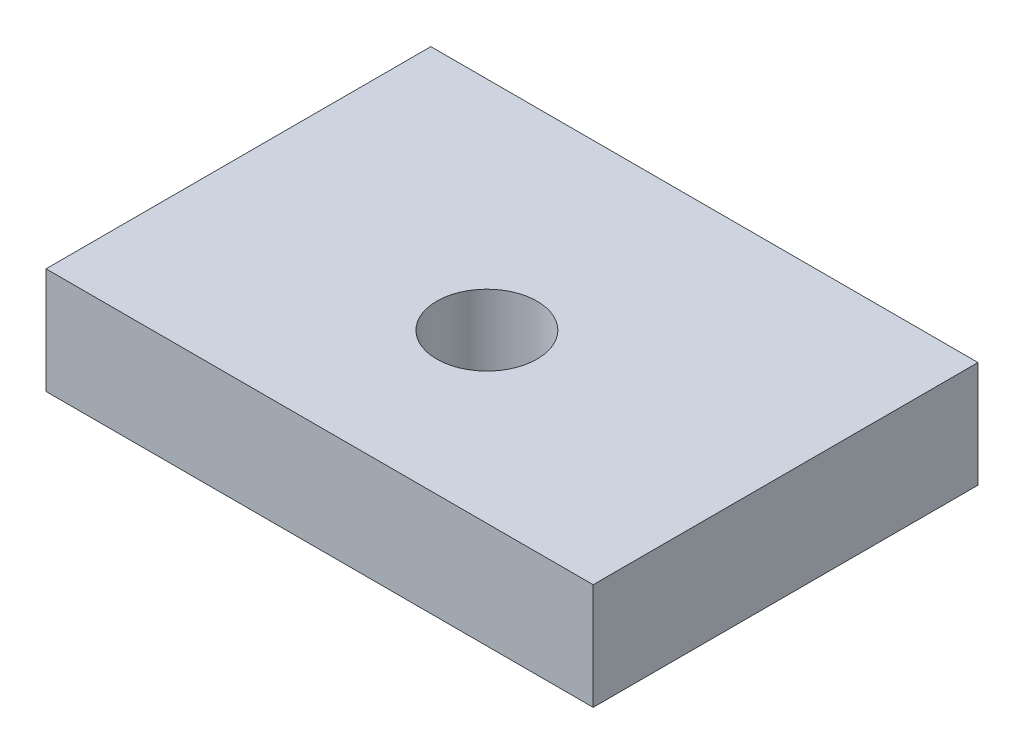
ISO-10303-21;
HEADER;
FILE_DESCRIPTION(('STEP AP214'),'2;1');
FILE_NAME('part.step','',(''),(''),'','','');
FILE_SCHEMA(('AUTOMOTIVE_DESIGN { 1 0 10303 214 1 1 1 1 }'));
ENDSEC;
DATA;
#1=APPLICATION_CONTEXT('core data for automotive mechanical design processes');
#2=APPLICATION_PROTOCOL_DEFINITION('international standard','automotive_design',2000,#1);
#3=PRODUCT_CONTEXT('',#1,'mechanical');
#4=PRODUCT('Part','Part','',(#3));
#5=PRODUCT_RELATED_PRODUCT_CATEGORY('part','',(#4));
#6=PRODUCT_DEFINITION_FORMATION('','',#4);
#7=PRODUCT_DEFINITION_CONTEXT('part definition',#1,'design');
#8=PRODUCT_DEFINITION('design','',#6,#7);
#9=PRODUCT_DEFINITION_SHAPE('','',#8);
#10=(LENGTH_UNIT() NAMED_UNIT(*) SI_UNIT(.MILLI.,.METRE.));
#11=(NAMED_UNIT(*) PLANE_ANGLE_UNIT() SI_UNIT($,.RADIAN.));
#12=(NAMED_UNIT(*) SI_UNIT($,.STERADIAN.) SOLID_ANGLE_UNIT());
#13=UNCERTAINTY_MEASURE_WITH_UNIT(LENGTH_MEASURE(1.E-05),#10,'distance_accuracy_value','');
#14=(GEOMETRIC_REPRESENTATION_CONTEXT(3) GLOBAL_UNCERTAINTY_ASSIGNED_CONTEXT((#13)) GLOBAL_UNIT_ASSIGNED_CONTEXT((#10,
#11,#12)) REPRESENTATION_CONTEXT('',''));
#15=CARTESIAN_POINT('',(0.,0.,0.));
#16=DIRECTION('',(0.,0.,1.));
#17=DIRECTION('',(1.,0.,0.));
#18=AXIS2_PLACEMENT_3D('',#15,#16,#17);
#19=CARTESIAN_POINT('',(0.,3.175,0.));
#20=DIRECTION('',(0.,-1.,0.));
#21=DIRECTION('',(0.,0.,-1.));
#22=AXIS2_PLACEMENT_3D('',#19,#20,#21);
#23=PLANE('',#22);
#24=DIRECTION('',(0.,0.,1.));
#25=VECTOR('',#24,1.);
#26=CARTESIAN_POINT('',(-16.35,3.175,10.));
#27=LINE('',#26,#25);
#28=CARTESIAN_POINT('',(-16.35,3.175,-13.));
#29=VERTEX_POINT('',#28);
#30=CARTESIAN_POINT('',(-16.35,3.175,10.));
#31=VERTEX_POINT('',#30);
#32=EDGE_CURVE('E85',#29,#31,#27,.T.);
#33=ORIENTED_EDGE('',*,*,#32,.T.);
#34=DIRECTION('',(1.,0.,0.));
#35=VECTOR('',#34,1.);
#36=CARTESIAN_POINT('',(-16.35,3.175,10.));
#37=LINE('',#36,#35);
#38=CARTESIAN_POINT('',(16.35,3.175,10.));
#39=VERTEX_POINT('',#38);
#40=EDGE_CURVE('E80',#31,#39,#37,.T.);
#41=ORIENTED_EDGE('',*,*,#40,.T.);
#42=DIRECTION('',(0.,0.,-1.));
#43=VECTOR('',#42,1.);
#44=CARTESIAN_POINT('',(16.35,3.175,10.));
#45=LINE('',#44,#43);
#46=CARTESIAN_POINT('',(16.35,3.175,-13.));
#47=VERTEX_POINT('',#46);
#48=EDGE_CURVE('E83',#39,#47,#45,.T.);
#49=ORIENTED_EDGE('',*,*,#48,.T.);
#50=DIRECTION('',(-1.,0.,0.));
#51=VECTOR('',#50,1.);
#52=CARTESIAN_POINT('',(-16.35,3.175,-13.));
#53=LINE('',#52,#51);
#54=EDGE_CURVE('E50',#47,#29,#53,.T.);
#55=ORIENTED_EDGE('',*,*,#54,.T.);
#56=EDGE_LOOP('',(#33,#41,#49,#55));
#57=FACE_BOUND('',#56,.T.);
#58=CARTESIAN_POINT('',(0.,3.175,0.));
#59=DIRECTION('',(0.,1.,0.));
#60=DIRECTION('',(0.,0.,1.));
#61=AXIS2_PLACEMENT_3D('',#58,#59,#60);
#62=CIRCLE('',#61,3.);
#63=CARTESIAN_POINT('',(0.,3.175,3.));
#64=VERTEX_POINT('',#63);
#65=EDGE_CURVE('E100',#64,#64,#62,.T.);
#66=ORIENTED_EDGE('',*,*,#65,.F.);
#67=EDGE_LOOP('',(#66));
#68=FACE_BOUND('',#67,.T.);
#69=ADVANCED_FACE('F33',(#57,#68),#23,.F.);
#70=CARTESIAN_POINT('',(0.,-3.175,0.));
#71=DIRECTION('',(0.,-1.,0.));
#72=DIRECTION('',(0.,0.,-1.));
#73=AXIS2_PLACEMENT_3D('',#70,#71,#72);
#74=PLANE('',#73);
#75=DIRECTION('',(0.,0.,1.));
#76=VECTOR('',#75,1.);
#77=CARTESIAN_POINT('',(-16.35,-3.175,10.));
#78=LINE('',#77,#76);
#79=CARTESIAN_POINT('',(-16.35,-3.175,-13.));
#80=VERTEX_POINT('',#79);
#81=CARTESIAN_POINT('',(-16.35,-3.175,10.));
#82=VERTEX_POINT('',#81);
#83=EDGE_CURVE('E97',#80,#82,#78,.T.);
#84=ORIENTED_EDGE('',*,*,#83,.F.);
#85=DIRECTION('',(-1.,0.,0.));
#86=VECTOR('',#85,1.);
#87=CARTESIAN_POINT('',(-16.35,-3.175,-13.));
#88=LINE('',#87,#86);
#89=CARTESIAN_POINT('',(16.35,-3.175,-13.));
#90=VERTEX_POINT('',#89);
#91=EDGE_CURVE('E73',#90,#80,#88,.T.);
#92=ORIENTED_EDGE('',*,*,#91,.F.);
#93=DIRECTION('',(0.,0.,-1.));
#94=VECTOR('',#93,1.);
#95=CARTESIAN_POINT('',(16.35,-3.175,10.));
#96=LINE('',#95,#94);
#97=CARTESIAN_POINT('',(16.35,-3.175,10.));
#98=VERTEX_POINT('',#97);
#99=EDGE_CURVE('E67',#98,#90,#96,.T.);
#100=ORIENTED_EDGE('',*,*,#99,.F.);
#101=DIRECTION('',(1.,0.,0.));
#102=VECTOR('',#101,1.);
#103=CARTESIAN_POINT('',(-16.35,-3.175,10.));
#104=LINE('',#103,#102);
#105=EDGE_CURVE('E89',#82,#98,#104,.T.);
#106=ORIENTED_EDGE('',*,*,#105,.F.);
#107=EDGE_LOOP('',(#84,#92,#100,#106));
#108=FACE_BOUND('',#107,.T.);
#109=CARTESIAN_POINT('',(0.,-3.175,0.));
#110=DIRECTION('',(0.,1.,0.));
#111=DIRECTION('',(0.,0.,1.));
#112=AXIS2_PLACEMENT_3D('',#109,#110,#111);
#113=CIRCLE('',#112,3.);
#114=CARTESIAN_POINT('',(0.,-3.175,3.));
#115=VERTEX_POINT('',#114);
#116=EDGE_CURVE('E112',#115,#115,#113,.T.);
#117=ORIENTED_EDGE('',*,*,#116,.T.);
#118=EDGE_LOOP('',(#117));
#119=FACE_BOUND('',#118,.T.);
#120=ADVANCED_FACE('F108',(#108,#119),#74,.T.);
#121=CARTESIAN_POINT('',(-16.35,3.175,10.));
#122=DIRECTION('',(1.,0.,0.));
#123=DIRECTION('',(0.,0.,-1.));
#124=AXIS2_PLACEMENT_3D('',#121,#122,#123);
#125=PLANE('',#124);
#126=ORIENTED_EDGE('',*,*,#83,.T.);
#127=DIRECTION('',(0.,-1.,0.));
#128=VECTOR('',#127,1.);
#129=CARTESIAN_POINT('',(-16.35,3.175,10.));
#130=LINE('',#129,#128);
#131=EDGE_CURVE('E11',#31,#82,#130,.T.);
#132=ORIENTED_EDGE('',*,*,#131,.F.);
#133=ORIENTED_EDGE('',*,*,#32,.F.);
#134=DIRECTION('',(0.,-1.,0.));
#135=VECTOR('',#134,1.);
#136=CARTESIAN_POINT('',(-16.35,3.175,-13.));
#137=LINE('',#136,#135);
#138=EDGE_CURVE('E93',#29,#80,#137,.T.);
#139=ORIENTED_EDGE('',*,*,#138,.T.);
#140=EDGE_LOOP('',(#126,#132,#133,#139));
#141=FACE_BOUND('',#140,.T.);
#142=ADVANCED_FACE('F35',(#141),#125,.F.);
#143=CARTESIAN_POINT('',(-16.35,3.175,10.));
#144=DIRECTION('',(0.,0.,-1.));
#145=DIRECTION('',(-1.,0.,0.));
#146=AXIS2_PLACEMENT_3D('',#143,#144,#145);
#147=PLANE('',#146);
#148=ORIENTED_EDGE('',*,*,#105,.T.);
#149=DIRECTION('',(0.,-1.,0.));
#150=VECTOR('',#149,1.);
#151=CARTESIAN_POINT('',(16.35,3.175,10.));
#152=LINE('',#151,#150);
#153=EDGE_CURVE('E42',#39,#98,#152,.T.);
#154=ORIENTED_EDGE('',*,*,#153,.F.);
#155=ORIENTED_EDGE('',*,*,#40,.F.);
#156=ORIENTED_EDGE('',*,*,#131,.T.);
#157=EDGE_LOOP('',(#148,#154,#155,#156));
#158=FACE_BOUND('',#157,.T.);
#159=ADVANCED_FACE('F88',(#158),#147,.F.);
#160=CARTESIAN_POINT('',(16.35,3.175,10.));
#161=DIRECTION('',(-1.,0.,0.));
#162=DIRECTION('',(0.,0.,1.));
#163=AXIS2_PLACEMENT_3D('',#160,#161,#162);
#164=PLANE('',#163);
#165=ORIENTED_EDGE('',*,*,#99,.T.);
#166=DIRECTION('',(0.,-1.,0.));
#167=VECTOR('',#166,1.);
#168=CARTESIAN_POINT('',(16.35,3.175,-13.));
#169=LINE('',#168,#167);
#170=EDGE_CURVE('E90',#47,#90,#169,.T.);
#171=ORIENTED_EDGE('',*,*,#170,.F.);
#172=ORIENTED_EDGE('',*,*,#48,.F.);
#173=ORIENTED_EDGE('',*,*,#153,.T.);
#174=EDGE_LOOP('',(#165,#171,#172,#173));
#175=FACE_BOUND('',#174,.T.);
#176=ADVANCED_FACE('F91',(#175),#164,.F.);
#177=CARTESIAN_POINT('',(-16.35,3.175,-13.));
#178=DIRECTION('',(0.,0.,1.));
#179=DIRECTION('',(1.,0.,0.));
#180=AXIS2_PLACEMENT_3D('',#177,#178,#179);
#181=PLANE('',#180);
#182=ORIENTED_EDGE('',*,*,#91,.T.);
#183=ORIENTED_EDGE('',*,*,#138,.F.);
#184=ORIENTED_EDGE('',*,*,#54,.F.);
#185=ORIENTED_EDGE('',*,*,#170,.T.);
#186=EDGE_LOOP('',(#182,#183,#184,#185));
#187=FACE_BOUND('',#186,.T.);
#188=ADVANCED_FACE('F105',(#187),#181,.F.);
#189=CARTESIAN_POINT('',(0.,3.175,0.));
#190=DIRECTION('',(0.,-1.,0.));
#191=DIRECTION('',(0.,0.,-1.));
#192=AXIS2_PLACEMENT_3D('',#189,#190,#191);
#193=CYLINDRICAL_SURFACE('',#192,3.);
#194=ORIENTED_EDGE('',*,*,#65,.T.);
#195=EDGE_LOOP('',(#194));
#196=FACE_BOUND('',#195,.T.);
#197=ORIENTED_EDGE('',*,*,#116,.F.);
#198=EDGE_LOOP('',(#197));
#199=FACE_BOUND('',#198,.T.);
#200=ADVANCED_FACE('F118',(#196,#199),#193,.F.);
#201=CLOSED_SHELL('',(#69,#120,#142,#159,#176,#188,#200));
#202=MANIFOLD_SOLID_BREP('B2',#201);
#203=ADVANCED_BREP_SHAPE_REPRESENTATION('',(#18,#202),#14);
#204=SHAPE_DEFINITION_REPRESENTATION(#9,#203);
ENDSEC;
END-ISO-10303-21;
